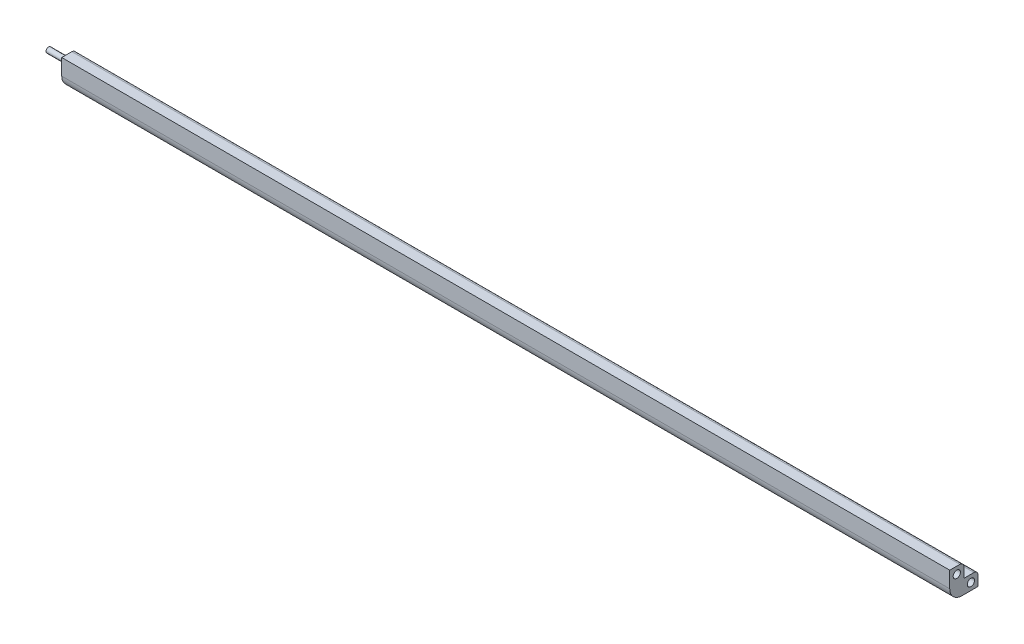
ISO-10303-21;
HEADER;
FILE_DESCRIPTION(('STEP AP214'),'2;1');
FILE_NAME('part.step','',(''),(''),'','','');
FILE_SCHEMA(('AUTOMOTIVE_DESIGN { 1 0 10303 214 1 1 1 1 }'));
ENDSEC;
DATA;
#1=APPLICATION_CONTEXT('core data for automotive mechanical design processes');
#2=APPLICATION_PROTOCOL_DEFINITION('international standard','automotive_design',2000,#1);
#3=PRODUCT_CONTEXT('',#1,'mechanical');
#4=PRODUCT('Part','Part','',(#3));
#5=PRODUCT_RELATED_PRODUCT_CATEGORY('part','',(#4));
#6=PRODUCT_DEFINITION_FORMATION('','',#4);
#7=PRODUCT_DEFINITION_CONTEXT('part definition',#1,'design');
#8=PRODUCT_DEFINITION('design','',#6,#7);
#9=PRODUCT_DEFINITION_SHAPE('','',#8);
#10=(LENGTH_UNIT() NAMED_UNIT(*) SI_UNIT(.MILLI.,.METRE.));
#11=(NAMED_UNIT(*) PLANE_ANGLE_UNIT() SI_UNIT($,.RADIAN.));
#12=(NAMED_UNIT(*) SI_UNIT($,.STERADIAN.) SOLID_ANGLE_UNIT());
#13=UNCERTAINTY_MEASURE_WITH_UNIT(LENGTH_MEASURE(1.E-05),#10,'distance_accuracy_value','');
#14=(GEOMETRIC_REPRESENTATION_CONTEXT(3) GLOBAL_UNCERTAINTY_ASSIGNED_CONTEXT((#13)) GLOBAL_UNIT_ASSIGNED_CONTEXT((#10,
#11,#12)) REPRESENTATION_CONTEXT('',''));
#15=CARTESIAN_POINT('',(0.,0.,0.));
#16=DIRECTION('',(0.,0.,1.));
#17=DIRECTION('',(1.,0.,0.));
#18=AXIS2_PLACEMENT_3D('',#15,#16,#17);
#19=CARTESIAN_POINT('',(190.787421601475,30.9707911556343,0.));
#20=DIRECTION('',(0.,1.,0.));
#21=DIRECTION('',(0.,0.,1.));
#22=AXIS2_PLACEMENT_3D('',#19,#20,#21);
#23=PLANE('',#22);
#24=DIRECTION('',(0.,0.,-1.));
#25=VECTOR('',#24,1.);
#26=CARTESIAN_POINT('',(190.787421601475,30.9707911556343,0.));
#27=LINE('',#26,#25);
#28=CARTESIAN_POINT('',(190.787421601475,30.9707911556343,-7.94517089119245));
#29=VERTEX_POINT('',#28);
#30=CARTESIAN_POINT('',(190.787421601475,30.9707911556343,-10.4451708911924));
#31=VERTEX_POINT('',#30);
#32=EDGE_CURVE('E128',#29,#31,#27,.T.);
#33=ORIENTED_EDGE('',*,*,#32,.T.);
#34=DIRECTION('',(-1.,0.,0.));
#35=VECTOR('',#34,1.);
#36=CARTESIAN_POINT('',(-29.2125783985252,30.9707911556343,-10.4451708911924));
#37=LINE('',#36,#35);
#38=CARTESIAN_POINT('',(-29.2125783985252,30.9707911556343,-10.4451708911924));
#39=VERTEX_POINT('',#38);
#40=EDGE_CURVE('E201',#31,#39,#37,.T.);
#41=ORIENTED_EDGE('',*,*,#40,.T.);
#42=DIRECTION('',(0.,0.,-1.));
#43=VECTOR('',#42,1.);
#44=CARTESIAN_POINT('',(-29.2125783985252,30.9707911556343,0.));
#45=LINE('',#44,#43);
#46=CARTESIAN_POINT('',(-29.2125783985252,30.9707911556343,-7.94517089119245));
#47=VERTEX_POINT('',#46);
#48=EDGE_CURVE('E135',#47,#39,#45,.T.);
#49=ORIENTED_EDGE('',*,*,#48,.F.);
#50=DIRECTION('',(-1.,0.,0.));
#51=VECTOR('',#50,1.);
#52=CARTESIAN_POINT('',(190.787421601475,30.9707911556343,-7.94517089119245));
#53=LINE('',#52,#51);
#54=EDGE_CURVE('E123',#29,#47,#53,.T.);
#55=ORIENTED_EDGE('',*,*,#54,.F.);
#56=EDGE_LOOP('',(#33,#41,#49,#55));
#57=FACE_BOUND('',#56,.T.);
#58=ADVANCED_FACE('F51',(#57),#23,.T.);
#59=CARTESIAN_POINT('',(190.787421601475,0.,-7.94517089119245));
#60=DIRECTION('',(0.,0.,-1.));
#61=DIRECTION('',(-1.,0.,0.));
#62=AXIS2_PLACEMENT_3D('',#59,#60,#61);
#63=PLANE('',#62);
#64=DIRECTION('',(0.,-1.,0.));
#65=VECTOR('',#64,1.);
#66=CARTESIAN_POINT('',(-29.2125783985252,0.,-7.94517089119245));
#67=LINE('',#66,#65);
#68=CARTESIAN_POINT('',(-29.2125783985252,33.4707911556343,-7.94517089119245));
#69=VERTEX_POINT('',#68);
#70=EDGE_CURVE('E170',#69,#47,#67,.T.);
#71=ORIENTED_EDGE('',*,*,#70,.F.);
#72=DIRECTION('',(-1.,0.,0.));
#73=VECTOR('',#72,1.);
#74=CARTESIAN_POINT('',(190.787421601475,33.4707911556343,-7.94517089119245));
#75=LINE('',#74,#73);
#76=CARTESIAN_POINT('',(190.787421601475,33.4707911556343,-7.94517089119245));
#77=VERTEX_POINT('',#76);
#78=EDGE_CURVE('E12',#69,#77,#75,.F.);
#79=ORIENTED_EDGE('',*,*,#78,.T.);
#80=DIRECTION('',(0.,-1.,0.));
#81=VECTOR('',#80,1.);
#82=CARTESIAN_POINT('',(190.787421601475,0.,-7.94517089119245));
#83=LINE('',#82,#81);
#84=EDGE_CURVE('E120',#77,#29,#83,.T.);
#85=ORIENTED_EDGE('',*,*,#84,.T.);
#86=ORIENTED_EDGE('',*,*,#54,.T.);
#87=EDGE_LOOP('',(#71,#79,#85,#86));
#88=FACE_BOUND('',#87,.T.);
#89=ADVANCED_FACE('F122',(#88),#63,.T.);
#90=CARTESIAN_POINT('',(190.787421601475,34.4707911556343,0.));
#91=DIRECTION('',(0.,-1.,0.));
#92=DIRECTION('',(0.,0.,-1.));
#93=AXIS2_PLACEMENT_3D('',#90,#91,#92);
#94=PLANE('',#93);
#95=DIRECTION('',(0.,0.,1.));
#96=VECTOR('',#95,1.);
#97=CARTESIAN_POINT('',(190.787421601475,34.4707911556343,0.));
#98=LINE('',#97,#96);
#99=CARTESIAN_POINT('',(190.787421601475,34.4707911556343,-6.94517089119245));
#100=VERTEX_POINT('',#99);
#101=CARTESIAN_POINT('',(190.787421601475,34.4707911556343,-4.44517089119244));
#102=VERTEX_POINT('',#101);
#103=EDGE_CURVE('E127',#100,#102,#98,.T.);
#104=ORIENTED_EDGE('',*,*,#103,.F.);
#105=DIRECTION('',(-1.,0.,0.));
#106=VECTOR('',#105,1.);
#107=CARTESIAN_POINT('',(-29.2125783985252,34.4707911556343,-6.94517089119245));
#108=LINE('',#107,#106);
#109=CARTESIAN_POINT('',(-29.2125783985252,34.4707911556343,-6.94517089119245));
#110=VERTEX_POINT('',#109);
#111=EDGE_CURVE('E60',#100,#110,#108,.T.);
#112=ORIENTED_EDGE('',*,*,#111,.T.);
#113=DIRECTION('',(0.,0.,1.));
#114=VECTOR('',#113,1.);
#115=CARTESIAN_POINT('',(-29.2125783985252,34.4707911556343,0.));
#116=LINE('',#115,#114);
#117=CARTESIAN_POINT('',(-29.2125783985252,34.4707911556343,-4.44517089119244));
#118=VERTEX_POINT('',#117);
#119=EDGE_CURVE('E174',#110,#118,#116,.T.);
#120=ORIENTED_EDGE('',*,*,#119,.T.);
#121=DIRECTION('',(-1.,0.,0.));
#122=VECTOR('',#121,1.);
#123=CARTESIAN_POINT('',(190.787421601475,34.4707911556343,-4.44517089119244));
#124=LINE('',#123,#122);
#125=EDGE_CURVE('E138',#102,#118,#124,.T.);
#126=ORIENTED_EDGE('',*,*,#125,.F.);
#127=EDGE_LOOP('',(#104,#112,#120,#126));
#128=FACE_BOUND('',#127,.T.);
#129=ADVANCED_FACE('F221',(#128),#94,.F.);
#130=CARTESIAN_POINT('',(190.787421601475,0.,-4.44517089119245));
#131=DIRECTION('',(0.,0.,-1.));
#132=DIRECTION('',(0.,1.,0.));
#133=AXIS2_PLACEMENT_3D('',#130,#131,#132);
#134=PLANE('',#133);
#135=DIRECTION('',(0.,-1.,0.));
#136=VECTOR('',#135,1.);
#137=CARTESIAN_POINT('',(-29.2125783985252,0.,-4.44517089119245));
#138=LINE('',#137,#136);
#139=CARTESIAN_POINT('',(-29.2125783985252,30.4707911556343,-4.44517089119244));
#140=VERTEX_POINT('',#139);
#141=EDGE_CURVE('E177',#118,#140,#138,.T.);
#142=ORIENTED_EDGE('',*,*,#141,.T.);
#143=DIRECTION('',(-1.,0.,0.));
#144=VECTOR('',#143,1.);
#145=CARTESIAN_POINT('',(190.787421601475,30.4707911556343,-4.44517089119244));
#146=LINE('',#145,#144);
#147=CARTESIAN_POINT('',(190.787421601475,30.4707911556343,-4.44517089119244));
#148=VERTEX_POINT('',#147);
#149=EDGE_CURVE('E195',#140,#148,#146,.F.);
#150=ORIENTED_EDGE('',*,*,#149,.T.);
#151=DIRECTION('',(0.,-1.,0.));
#152=VECTOR('',#151,1.);
#153=CARTESIAN_POINT('',(190.787421601475,0.,-4.44517089119245));
#154=LINE('',#153,#152);
#155=EDGE_CURVE('E157',#102,#148,#154,.T.);
#156=ORIENTED_EDGE('',*,*,#155,.F.);
#157=ORIENTED_EDGE('',*,*,#125,.T.);
#158=EDGE_LOOP('',(#142,#150,#156,#157));
#159=FACE_BOUND('',#158,.T.);
#160=ADVANCED_FACE('F230',(#159),#134,.F.);
#161=CARTESIAN_POINT('',(190.787421601475,27.4707911556343,0.));
#162=DIRECTION('',(0.,1.,0.));
#163=DIRECTION('',(0.,0.,1.));
#164=AXIS2_PLACEMENT_3D('',#161,#162,#163);
#165=PLANE('',#164);
#166=DIRECTION('',(0.,0.,-1.));
#167=VECTOR('',#166,1.);
#168=CARTESIAN_POINT('',(190.787421601475,27.4707911556343,0.));
#169=LINE('',#168,#167);
#170=CARTESIAN_POINT('',(190.787421601475,27.4707911556343,-7.44517089119244));
#171=VERTEX_POINT('',#170);
#172=CARTESIAN_POINT('',(190.787421601475,27.4707911556343,-11.4451708911924));
#173=VERTEX_POINT('',#172);
#174=EDGE_CURVE('E161',#171,#173,#169,.T.);
#175=ORIENTED_EDGE('',*,*,#174,.F.);
#176=DIRECTION('',(-1.,0.,0.));
#177=VECTOR('',#176,1.);
#178=CARTESIAN_POINT('',(190.787421601475,27.4707911556343,-7.44517089119244));
#179=LINE('',#178,#177);
#180=CARTESIAN_POINT('',(-29.2125783985252,27.4707911556343,-7.44517089119244));
#181=VERTEX_POINT('',#180);
#182=EDGE_CURVE('E137',#171,#181,#179,.T.);
#183=ORIENTED_EDGE('',*,*,#182,.T.);
#184=DIRECTION('',(0.,0.,-1.));
#185=VECTOR('',#184,1.);
#186=CARTESIAN_POINT('',(-29.2125783985252,27.4707911556343,0.));
#187=LINE('',#186,#185);
#188=CARTESIAN_POINT('',(-29.2125783985252,27.4707911556343,-11.4451708911924));
#189=VERTEX_POINT('',#188);
#190=EDGE_CURVE('E149',#181,#189,#187,.T.);
#191=ORIENTED_EDGE('',*,*,#190,.T.);
#192=DIRECTION('',(-1.,0.,0.));
#193=VECTOR('',#192,1.);
#194=CARTESIAN_POINT('',(190.787421601475,27.4707911556343,-11.4451708911924));
#195=LINE('',#194,#193);
#196=EDGE_CURVE('E167',#173,#189,#195,.T.);
#197=ORIENTED_EDGE('',*,*,#196,.F.);
#198=EDGE_LOOP('',(#175,#183,#191,#197));
#199=FACE_BOUND('',#198,.T.);
#200=ADVANCED_FACE('F239',(#199),#165,.F.);
#201=CARTESIAN_POINT('',(190.787421601475,0.,-11.4451708911924));
#202=DIRECTION('',(0.,0.,1.));
#203=DIRECTION('',(0.,-1.,0.));
#204=AXIS2_PLACEMENT_3D('',#201,#202,#203);
#205=PLANE('',#204);
#206=DIRECTION('',(0.,1.,0.));
#207=VECTOR('',#206,1.);
#208=CARTESIAN_POINT('',(-29.2125783985252,0.,-11.4451708911924));
#209=LINE('',#208,#207);
#210=CARTESIAN_POINT('',(-29.2125783985252,29.9707911556343,-11.4451708911924));
#211=VERTEX_POINT('',#210);
#212=EDGE_CURVE('E145',#189,#211,#209,.T.);
#213=ORIENTED_EDGE('',*,*,#212,.T.);
#214=DIRECTION('',(-1.,0.,0.));
#215=VECTOR('',#214,1.);
#216=CARTESIAN_POINT('',(190.787421601475,29.9707911556343,-11.4451708911924));
#217=LINE('',#216,#215);
#218=CARTESIAN_POINT('',(190.787421601475,29.9707911556343,-11.4451708911924));
#219=VERTEX_POINT('',#218);
#220=EDGE_CURVE('E210',#211,#219,#217,.F.);
#221=ORIENTED_EDGE('',*,*,#220,.T.);
#222=DIRECTION('',(0.,1.,0.));
#223=VECTOR('',#222,1.);
#224=CARTESIAN_POINT('',(190.787421601475,0.,-11.4451708911924));
#225=LINE('',#224,#223);
#226=EDGE_CURVE('E164',#173,#219,#225,.T.);
#227=ORIENTED_EDGE('',*,*,#226,.F.);
#228=ORIENTED_EDGE('',*,*,#196,.T.);
#229=EDGE_LOOP('',(#213,#221,#227,#228));
#230=FACE_BOUND('',#229,.T.);
#231=ADVANCED_FACE('F243',(#230),#205,.F.);
#232=CARTESIAN_POINT('',(190.787421601475,0.,0.));
#233=DIRECTION('',(1.,0.,0.));
#234=DIRECTION('',(0.,0.,-1.));
#235=AXIS2_PLACEMENT_3D('',#232,#233,#234);
#236=PLANE('',#235);
#237=CARTESIAN_POINT('',(190.787421601475,32.7207911556343,-6.19517089119244));
#238=DIRECTION('',(1.,0.,0.));
#239=DIRECTION('',(0.,0.,-1.));
#240=AXIS2_PLACEMENT_3D('',#237,#238,#239);
#241=CIRCLE('',#240,0.899999999999998);
#242=CARTESIAN_POINT('',(190.787421601475,32.7207911556343,-7.09517089119244));
#243=VERTEX_POINT('',#242);
#244=EDGE_CURVE('E506',#243,#243,#241,.T.);
#245=ORIENTED_EDGE('',*,*,#244,.F.);
#246=EDGE_LOOP('',(#245));
#247=FACE_BOUND('',#246,.T.);
#248=CARTESIAN_POINT('',(190.787421601475,29.2207911556343,-9.69517089119244));
#249=DIRECTION('',(1.,0.,0.));
#250=DIRECTION('',(0.,0.,-1.));
#251=AXIS2_PLACEMENT_3D('',#248,#249,#250);
#252=CIRCLE('',#251,0.900000000000004);
#253=CARTESIAN_POINT('',(190.787421601475,29.2207911556343,-10.5951708911924));
#254=VERTEX_POINT('',#253);
#255=EDGE_CURVE('E509',#254,#254,#252,.T.);
#256=ORIENTED_EDGE('',*,*,#255,.F.);
#257=EDGE_LOOP('',(#256));
#258=FACE_BOUND('',#257,.T.);
#259=ORIENTED_EDGE('',*,*,#226,.T.);
#260=CARTESIAN_POINT('',(190.787421601475,29.9707911556343,-10.4451708911924));
#261=DIRECTION('',(1.,0.,0.));
#262=DIRECTION('',(0.,0.,-1.));
#263=AXIS2_PLACEMENT_3D('',#260,#261,#262);
#264=CIRCLE('',#263,1.);
#265=EDGE_CURVE('E143',#219,#31,#264,.T.);
#266=ORIENTED_EDGE('',*,*,#265,.T.);
#267=ORIENTED_EDGE('',*,*,#32,.F.);
#268=ORIENTED_EDGE('',*,*,#84,.F.);
#269=CARTESIAN_POINT('',(190.787421601475,33.4707911556343,-6.94517089119245));
#270=DIRECTION('',(1.,0.,0.));
#271=DIRECTION('',(0.,0.,-1.));
#272=AXIS2_PLACEMENT_3D('',#269,#270,#271);
#273=CIRCLE('',#272,1.);
#274=EDGE_CURVE('E67',#77,#100,#273,.T.);
#275=ORIENTED_EDGE('',*,*,#274,.T.);
#276=ORIENTED_EDGE('',*,*,#103,.T.);
#277=ORIENTED_EDGE('',*,*,#155,.T.);
#278=CARTESIAN_POINT('',(190.787421601475,30.4707911556343,-7.44517089119244));
#279=DIRECTION('',(1.,0.,0.));
#280=DIRECTION('',(0.,0.,-1.));
#281=AXIS2_PLACEMENT_3D('',#278,#279,#280);
#282=CIRCLE('',#281,3.);
#283=EDGE_CURVE('E198',#148,#171,#282,.T.);
#284=ORIENTED_EDGE('',*,*,#283,.T.);
#285=ORIENTED_EDGE('',*,*,#174,.T.);
#286=EDGE_LOOP('',(#259,#266,#267,#268,#275,#276,#277,#284,#285));
#287=FACE_BOUND('',#286,.T.);
#288=ADVANCED_FACE('F141',(#247,#258,#287),#236,.T.);
#289=CARTESIAN_POINT('',(-29.2125783985252,0.,0.));
#290=DIRECTION('',(1.,0.,0.));
#291=DIRECTION('',(0.,0.,-1.));
#292=AXIS2_PLACEMENT_3D('',#289,#290,#291);
#293=PLANE('',#292);
#294=CARTESIAN_POINT('',(-29.2125783985252,29.2207911556343,-9.69517089119244));
#295=DIRECTION('',(1.,0.,0.));
#296=DIRECTION('',(0.,0.,-1.));
#297=AXIS2_PLACEMENT_3D('',#294,#295,#296);
#298=CIRCLE('',#297,0.649999999999999);
#299=CARTESIAN_POINT('',(-29.2125783985252,29.2207911556343,-10.3451708911924));
#300=VERTEX_POINT('',#299);
#301=EDGE_CURVE('E486',#300,#300,#298,.T.);
#302=ORIENTED_EDGE('',*,*,#301,.T.);
#303=EDGE_LOOP('',(#302));
#304=FACE_BOUND('',#303,.T.);
#305=CARTESIAN_POINT('',(-29.2125783985252,32.7207911556343,-6.19517089119245));
#306=DIRECTION('',(1.,0.,0.));
#307=DIRECTION('',(0.,0.,-1.));
#308=AXIS2_PLACEMENT_3D('',#305,#306,#307);
#309=CIRCLE('',#308,0.649999999999999);
#310=CARTESIAN_POINT('',(-29.2125783985252,32.7207911556343,-6.84517089119245));
#311=VERTEX_POINT('',#310);
#312=EDGE_CURVE('E489',#311,#311,#309,.T.);
#313=ORIENTED_EDGE('',*,*,#312,.T.);
#314=EDGE_LOOP('',(#313));
#315=FACE_BOUND('',#314,.T.);
#316=ORIENTED_EDGE('',*,*,#48,.T.);
#317=CARTESIAN_POINT('',(-29.2125783985252,29.9707911556343,-10.4451708911924));
#318=DIRECTION('',(1.,0.,0.));
#319=DIRECTION('',(0.,0.,-1.));
#320=AXIS2_PLACEMENT_3D('',#317,#318,#319);
#321=CIRCLE('',#320,1.);
#322=EDGE_CURVE('E207',#39,#211,#321,.F.);
#323=ORIENTED_EDGE('',*,*,#322,.T.);
#324=ORIENTED_EDGE('',*,*,#212,.F.);
#325=ORIENTED_EDGE('',*,*,#190,.F.);
#326=CARTESIAN_POINT('',(-29.2125783985252,30.4707911556343,-7.44517089119244));
#327=DIRECTION('',(1.,0.,0.));
#328=DIRECTION('',(0.,0.,-1.));
#329=AXIS2_PLACEMENT_3D('',#326,#327,#328);
#330=CIRCLE('',#329,3.);
#331=EDGE_CURVE('E192',#181,#140,#330,.F.);
#332=ORIENTED_EDGE('',*,*,#331,.T.);
#333=ORIENTED_EDGE('',*,*,#141,.F.);
#334=ORIENTED_EDGE('',*,*,#119,.F.);
#335=CARTESIAN_POINT('',(-29.2125783985252,33.4707911556343,-6.94517089119245));
#336=DIRECTION('',(1.,0.,0.));
#337=DIRECTION('',(0.,0.,-1.));
#338=AXIS2_PLACEMENT_3D('',#335,#336,#337);
#339=CIRCLE('',#338,1.);
#340=EDGE_CURVE('E204',#110,#69,#339,.F.);
#341=ORIENTED_EDGE('',*,*,#340,.T.);
#342=ORIENTED_EDGE('',*,*,#70,.T.);
#343=EDGE_LOOP('',(#316,#323,#324,#325,#332,#333,#334,#341,#342));
#344=FACE_BOUND('',#343,.T.);
#345=ADVANCED_FACE('F226',(#304,#315,#344),#293,.F.);
#346=CARTESIAN_POINT('',(184.787421601475,29.2207911556343,-9.69517089119244));
#347=DIRECTION('',(1.,0.,0.));
#348=DIRECTION('',(0.,0.,-1.));
#349=AXIS2_PLACEMENT_3D('',#346,#347,#348);
#350=CYLINDRICAL_SURFACE('',#349,0.900000000000004);
#351=CARTESIAN_POINT('',(184.787421601475,29.2207911556343,-9.69517089119244));
#352=DIRECTION('',(1.,0.,0.));
#353=DIRECTION('',(0.,0.,-1.));
#354=AXIS2_PLACEMENT_3D('',#351,#352,#353);
#355=CIRCLE('',#354,0.900000000000004);
#356=CARTESIAN_POINT('',(184.787421601475,29.2207911556343,-10.5951708911924));
#357=VERTEX_POINT('',#356);
#358=EDGE_CURVE('E152',#357,#357,#355,.T.);
#359=ORIENTED_EDGE('',*,*,#358,.F.);
#360=EDGE_LOOP('',(#359));
#361=FACE_BOUND('',#360,.T.);
#362=ORIENTED_EDGE('',*,*,#255,.T.);
#363=EDGE_LOOP('',(#362));
#364=FACE_BOUND('',#363,.T.);
#365=ADVANCED_FACE('F291',(#361,#364),#350,.F.);
#366=CARTESIAN_POINT('',(184.787421601475,0.,0.));
#367=DIRECTION('',(1.,0.,0.));
#368=DIRECTION('',(0.,0.,-1.));
#369=AXIS2_PLACEMENT_3D('',#366,#367,#368);
#370=PLANE('',#369);
#371=ORIENTED_EDGE('',*,*,#358,.T.);
#372=EDGE_LOOP('',(#371));
#373=FACE_BOUND('',#372,.T.);
#374=ADVANCED_FACE('F289',(#373),#370,.T.);
#375=CARTESIAN_POINT('',(184.787421601475,32.7207911556343,-6.19517089119244));
#376=DIRECTION('',(1.,0.,0.));
#377=DIRECTION('',(0.,0.,-1.));
#378=AXIS2_PLACEMENT_3D('',#375,#376,#377);
#379=CYLINDRICAL_SURFACE('',#378,0.899999999999998);
#380=CARTESIAN_POINT('',(184.787421601475,32.7207911556343,-6.19517089119244));
#381=DIRECTION('',(1.,0.,0.));
#382=DIRECTION('',(0.,0.,-1.));
#383=AXIS2_PLACEMENT_3D('',#380,#381,#382);
#384=CIRCLE('',#383,0.899999999999998);
#385=CARTESIAN_POINT('',(184.787421601475,32.7207911556343,-7.09517089119244));
#386=VERTEX_POINT('',#385);
#387=EDGE_CURVE('E171',#386,#386,#384,.T.);
#388=ORIENTED_EDGE('',*,*,#387,.F.);
#389=EDGE_LOOP('',(#388));
#390=FACE_BOUND('',#389,.T.);
#391=ORIENTED_EDGE('',*,*,#244,.T.);
#392=EDGE_LOOP('',(#391));
#393=FACE_BOUND('',#392,.T.);
#394=ADVANCED_FACE('F285',(#390,#393),#379,.F.);
#395=CARTESIAN_POINT('',(184.787421601475,0.,0.));
#396=DIRECTION('',(1.,0.,0.));
#397=DIRECTION('',(0.,0.,-1.));
#398=AXIS2_PLACEMENT_3D('',#395,#396,#397);
#399=PLANE('',#398);
#400=ORIENTED_EDGE('',*,*,#387,.T.);
#401=EDGE_LOOP('',(#400));
#402=FACE_BOUND('',#401,.T.);
#403=ADVANCED_FACE('F281',(#402),#399,.T.);
#404=CARTESIAN_POINT('',(-34.2125783985252,32.7207911556343,-6.19517089119245));
#405=DIRECTION('',(1.,0.,0.));
#406=DIRECTION('',(0.,0.,-1.));
#407=AXIS2_PLACEMENT_3D('',#404,#405,#406);
#408=CYLINDRICAL_SURFACE('',#407,0.649999999999999);
#409=CARTESIAN_POINT('',(-34.2125783985252,32.7207911556343,-6.19517089119245));
#410=DIRECTION('',(1.,0.,0.));
#411=DIRECTION('',(0.,0.,-1.));
#412=AXIS2_PLACEMENT_3D('',#409,#410,#411);
#413=CIRCLE('',#412,0.649999999999999);
#414=CARTESIAN_POINT('',(-34.2125783985252,32.7207911556343,-6.84517089119245));
#415=VERTEX_POINT('',#414);
#416=EDGE_CURVE('E492',#415,#415,#413,.T.);
#417=ORIENTED_EDGE('',*,*,#416,.T.);
#418=EDGE_LOOP('',(#417));
#419=FACE_BOUND('',#418,.T.);
#420=ORIENTED_EDGE('',*,*,#312,.F.);
#421=EDGE_LOOP('',(#420));
#422=FACE_BOUND('',#421,.T.);
#423=ADVANCED_FACE('F277',(#419,#422),#408,.T.);
#424=CARTESIAN_POINT('',(-34.2125783985252,0.,0.));
#425=DIRECTION('',(1.,0.,0.));
#426=DIRECTION('',(0.,0.,-1.));
#427=AXIS2_PLACEMENT_3D('',#424,#425,#426);
#428=PLANE('',#427);
#429=ORIENTED_EDGE('',*,*,#416,.F.);
#430=EDGE_LOOP('',(#429));
#431=FACE_BOUND('',#430,.T.);
#432=ADVANCED_FACE('F270',(#431),#428,.F.);
#433=CARTESIAN_POINT('',(-34.2125783985252,29.2207911556343,-9.69517089119244));
#434=DIRECTION('',(1.,0.,0.));
#435=DIRECTION('',(0.,0.,-1.));
#436=AXIS2_PLACEMENT_3D('',#433,#434,#435);
#437=CYLINDRICAL_SURFACE('',#436,0.649999999999999);
#438=CARTESIAN_POINT('',(-34.2125783985252,29.2207911556343,-9.69517089119244));
#439=DIRECTION('',(1.,0.,0.));
#440=DIRECTION('',(0.,0.,-1.));
#441=AXIS2_PLACEMENT_3D('',#438,#439,#440);
#442=CIRCLE('',#441,0.649999999999999);
#443=CARTESIAN_POINT('',(-34.2125783985252,29.2207911556343,-10.3451708911924));
#444=VERTEX_POINT('',#443);
#445=EDGE_CURVE('E493',#444,#444,#442,.T.);
#446=ORIENTED_EDGE('',*,*,#445,.T.);
#447=EDGE_LOOP('',(#446));
#448=FACE_BOUND('',#447,.T.);
#449=ORIENTED_EDGE('',*,*,#301,.F.);
#450=EDGE_LOOP('',(#449));
#451=FACE_BOUND('',#450,.T.);
#452=ADVANCED_FACE('F264',(#448,#451),#437,.T.);
#453=CARTESIAN_POINT('',(-34.2125783985252,0.,0.));
#454=DIRECTION('',(1.,0.,0.));
#455=DIRECTION('',(0.,0.,-1.));
#456=AXIS2_PLACEMENT_3D('',#453,#454,#455);
#457=PLANE('',#456);
#458=ORIENTED_EDGE('',*,*,#445,.F.);
#459=EDGE_LOOP('',(#458));
#460=FACE_BOUND('',#459,.T.);
#461=ADVANCED_FACE('F260',(#460),#457,.F.);
#462=CARTESIAN_POINT('',(190.787421601475,30.4707911556343,-7.44517089119244));
#463=DIRECTION('',(-1.,0.,0.));
#464=DIRECTION('',(0.,0.,1.));
#465=AXIS2_PLACEMENT_3D('',#462,#463,#464);
#466=CYLINDRICAL_SURFACE('',#465,3.);
#467=ORIENTED_EDGE('',*,*,#283,.F.);
#468=ORIENTED_EDGE('',*,*,#149,.F.);
#469=ORIENTED_EDGE('',*,*,#331,.F.);
#470=ORIENTED_EDGE('',*,*,#182,.F.);
#471=EDGE_LOOP('',(#467,#468,#469,#470));
#472=FACE_BOUND('',#471,.T.);
#473=ADVANCED_FACE('F234',(#472),#466,.T.);
#474=CARTESIAN_POINT('',(190.787421601475,29.9707911556343,-10.4451708911924));
#475=DIRECTION('',(1.,0.,0.));
#476=DIRECTION('',(0.,0.,-1.));
#477=AXIS2_PLACEMENT_3D('',#474,#475,#476);
#478=CYLINDRICAL_SURFACE('',#477,1.);
#479=ORIENTED_EDGE('',*,*,#265,.F.);
#480=ORIENTED_EDGE('',*,*,#220,.F.);
#481=ORIENTED_EDGE('',*,*,#322,.F.);
#482=ORIENTED_EDGE('',*,*,#40,.F.);
#483=EDGE_LOOP('',(#479,#480,#481,#482));
#484=FACE_BOUND('',#483,.T.);
#485=ADVANCED_FACE('F246',(#484),#478,.T.);
#486=CARTESIAN_POINT('',(190.787421601475,33.4707911556343,-6.94517089119245));
#487=DIRECTION('',(1.,0.,0.));
#488=DIRECTION('',(0.,0.,-1.));
#489=AXIS2_PLACEMENT_3D('',#486,#487,#488);
#490=CYLINDRICAL_SURFACE('',#489,1.);
#491=ORIENTED_EDGE('',*,*,#274,.F.);
#492=ORIENTED_EDGE('',*,*,#78,.F.);
#493=ORIENTED_EDGE('',*,*,#340,.F.);
#494=ORIENTED_EDGE('',*,*,#111,.F.);
#495=EDGE_LOOP('',(#491,#492,#493,#494));
#496=FACE_BOUND('',#495,.T.);
#497=ADVANCED_FACE('F53',(#496),#490,.T.);
#498=CLOSED_SHELL('',(#58,#89,#129,#160,#200,#231,#288,#345,#365,#374,#394,#403,#423,#432,#452,
#461,#473,#485,#497));
#499=MANIFOLD_SOLID_BREP('B2',#498);
#500=ADVANCED_BREP_SHAPE_REPRESENTATION('',(#18,#499),#14);
#501=SHAPE_DEFINITION_REPRESENTATION(#9,#500);
ENDSEC;
END-ISO-10303-21;
